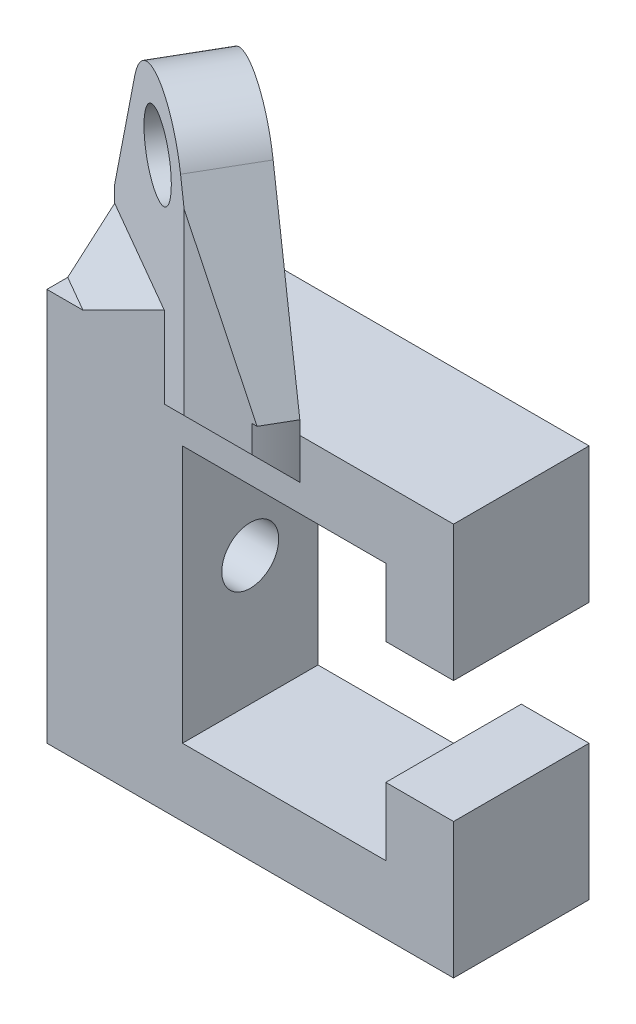
ISO-10303-21;
HEADER;
FILE_DESCRIPTION(('STEP AP214'),'2;1');
FILE_NAME('part.step','',(''),(''),'','','');
FILE_SCHEMA(('AUTOMOTIVE_DESIGN { 1 0 10303 214 1 1 1 1 }'));
ENDSEC;
DATA;
#1=APPLICATION_CONTEXT('core data for automotive mechanical design processes');
#2=APPLICATION_PROTOCOL_DEFINITION('international standard','automotive_design',2000,#1);
#3=PRODUCT_CONTEXT('',#1,'mechanical');
#4=PRODUCT('Part','Part','',(#3));
#5=PRODUCT_RELATED_PRODUCT_CATEGORY('part','',(#4));
#6=PRODUCT_DEFINITION_FORMATION('','',#4);
#7=PRODUCT_DEFINITION_CONTEXT('part definition',#1,'design');
#8=PRODUCT_DEFINITION('design','',#6,#7);
#9=PRODUCT_DEFINITION_SHAPE('','',#8);
#10=(LENGTH_UNIT() NAMED_UNIT(*) SI_UNIT(.MILLI.,.METRE.));
#11=(NAMED_UNIT(*) PLANE_ANGLE_UNIT() SI_UNIT($,.RADIAN.));
#12=(NAMED_UNIT(*) SI_UNIT($,.STERADIAN.) SOLID_ANGLE_UNIT());
#13=UNCERTAINTY_MEASURE_WITH_UNIT(LENGTH_MEASURE(1.E-05),#10,'distance_accuracy_value','');
#14=(GEOMETRIC_REPRESENTATION_CONTEXT(3) GLOBAL_UNCERTAINTY_ASSIGNED_CONTEXT((#13)) GLOBAL_UNIT_ASSIGNED_CONTEXT((#10,
#11,#12)) REPRESENTATION_CONTEXT('',''));
#15=CARTESIAN_POINT('',(0.,0.,0.));
#16=DIRECTION('',(0.,0.,1.));
#17=DIRECTION('',(1.,0.,0.));
#18=AXIS2_PLACEMENT_3D('',#15,#16,#17);
#19=CARTESIAN_POINT('',(0.,25.,0.));
#20=DIRECTION('',(0.,-1.,0.));
#21=DIRECTION('',(1.,0.,0.));
#22=AXIS2_PLACEMENT_3D('',#19,#20,#21);
#23=CYLINDRICAL_SURFACE('',#22,10.);
#24=DIRECTION('',(0.,-1.,0.));
#25=VECTOR('',#24,1.);
#26=CARTESIAN_POINT('',(7.14142842854284,25.,7.));
#27=LINE('',#26,#25);
#28=CARTESIAN_POINT('',(7.14142842854284,23.,7.));
#29=VERTEX_POINT('',#28);
#30=CARTESIAN_POINT('',(7.14142842854284,25.,7.));
#31=VERTEX_POINT('',#30);
#32=EDGE_CURVE('E236',#29,#31,#27,.F.);
#33=ORIENTED_EDGE('',*,*,#32,.F.);
#34=CARTESIAN_POINT('',(0.,15.9999999999999,0.));
#35=DIRECTION('',(0.,0.707106781186544,-0.707106781186551));
#36=DIRECTION('',(0.,-0.707106781186551,-0.707106781186544));
#37=AXIS2_PLACEMENT_3D('',#34,#35,#36);
#38=ELLIPSE('',#37,14.142135623731,10.);
#39=CARTESIAN_POINT('',(8.66025403784438,20.9999999999999,5.));
#40=VERTEX_POINT('',#39);
#41=EDGE_CURVE('E11',#29,#40,#38,.T.);
#42=ORIENTED_EDGE('',*,*,#41,.T.);
#43=DIRECTION('',(0.,-1.,0.));
#44=VECTOR('',#43,1.);
#45=CARTESIAN_POINT('',(8.66025403784437,24.,5.00000000000001));
#46=LINE('',#45,#44);
#47=CARTESIAN_POINT('',(8.66025403784437,24.,5.00000000000001));
#48=VERTEX_POINT('',#47);
#49=EDGE_CURVE('E50',#48,#40,#46,.T.);
#50=ORIENTED_EDGE('',*,*,#49,.F.);
#51=DIRECTION('',(0.,1.,0.));
#52=VECTOR('',#51,1.);
#53=CARTESIAN_POINT('',(8.66025403784437,24.,5.00000000000001));
#54=LINE('',#53,#52);
#55=CARTESIAN_POINT('',(8.66025403784437,25.,5.00000000000001));
#56=VERTEX_POINT('',#55);
#57=EDGE_CURVE('E208',#48,#56,#54,.T.);
#58=ORIENTED_EDGE('',*,*,#57,.T.);
#59=CARTESIAN_POINT('',(0.,25.,0.));
#60=DIRECTION('',(0.,1.,0.));
#61=DIRECTION('',(-1.,0.,0.));
#62=AXIS2_PLACEMENT_3D('',#59,#60,#61);
#63=CIRCLE('',#62,10.);
#64=EDGE_CURVE('E260',#31,#56,#63,.T.);
#65=ORIENTED_EDGE('',*,*,#64,.F.);
#66=EDGE_LOOP('',(#33,#42,#50,#58,#65));
#67=FACE_BOUND('',#66,.T.);
#68=ADVANCED_FACE('F35',(#67),#23,.T.);
#69=CARTESIAN_POINT('',(6.16025403784437,25.,9.3301270189222));
#70=DIRECTION('',(0.,1.,0.));
#71=DIRECTION('',(0.,0.,1.));
#72=AXIS2_PLACEMENT_3D('',#69,#70,#71);
#73=PLANE('',#72);
#74=DIRECTION('',(1.,0.,0.));
#75=VECTOR('',#74,1.);
#76=CARTESIAN_POINT('',(6.16025403784437,25.,7.));
#77=LINE('',#76,#75);
#78=CARTESIAN_POINT('',(7.50555349946513,25.,7.));
#79=VERTEX_POINT('',#78);
#80=EDGE_CURVE('E234',#31,#79,#77,.T.);
#81=ORIENTED_EDGE('',*,*,#80,.F.);
#82=ORIENTED_EDGE('',*,*,#64,.T.);
#83=DIRECTION('',(0.500000000000001,0.,-0.866025403784438));
#84=VECTOR('',#83,1.);
#85=CARTESIAN_POINT('',(6.16025403784437,25.,9.3301270189222));
#86=LINE('',#85,#84);
#87=EDGE_CURVE('E216',#79,#56,#86,.T.);
#88=ORIENTED_EDGE('',*,*,#87,.F.);
#89=EDGE_LOOP('',(#81,#82,#88));
#90=FACE_BOUND('',#89,.T.);
#91=ADVANCED_FACE('F395',(#90),#73,.F.);
#92=CARTESIAN_POINT('',(-2.50000000000001,36.,4.33012701892219));
#93=DIRECTION('',(-0.500000000000001,0.,0.866025403784438));
#94=DIRECTION('',(0.866025403784438,0.,0.500000000000001));
#95=AXIS2_PLACEMENT_3D('',#92,#93,#94);
#96=PLANE('',#95);
#97=DIRECTION('',(0.,1.,0.));
#98=VECTOR('',#97,1.);
#99=CARTESIAN_POINT('',(-10.,36.,0.));
#100=LINE('',#99,#98);
#101=CARTESIAN_POINT('',(-10.,27.,0.));
#102=VERTEX_POINT('',#101);
#103=CARTESIAN_POINT('',(-10.,28.2153903091735,0.));
#104=VERTEX_POINT('',#103);
#105=EDGE_CURVE('E223',#102,#104,#100,.T.);
#106=ORIENTED_EDGE('',*,*,#105,.F.);
#107=DIRECTION('',(0.866025403784438,0.,0.500000000000001));
#108=VECTOR('',#107,1.);
#109=CARTESIAN_POINT('',(-2.5,27.,4.33012701892219));
#110=LINE('',#109,#108);
#111=CARTESIAN_POINT('',(-1.33974596215562,27.,5.));
#112=VERTEX_POINT('',#111);
#113=EDGE_CURVE('E362',#102,#112,#110,.T.);
#114=ORIENTED_EDGE('',*,*,#113,.T.);
#115=DIRECTION('',(0.,-1.,0.));
#116=VECTOR('',#115,1.);
#117=CARTESIAN_POINT('',(-1.33974596215562,0.,5.));
#118=LINE('',#117,#116);
#119=CARTESIAN_POINT('',(-1.33974596215562,20.9999999999999,5.));
#120=VERTEX_POINT('',#119);
#121=EDGE_CURVE('E360',#112,#120,#118,.T.);
#122=ORIENTED_EDGE('',*,*,#121,.T.);
#123=DIRECTION('',(0.774596669241481,0.447213595499962,0.447213595499958));
#124=VECTOR('',#123,1.);
#125=CARTESIAN_POINT('',(-0.535898384862253,21.4641016151377,5.46410161513775));
#126=LINE('',#125,#124);
#127=CARTESIAN_POINT('',(2.12435565298213,23.,7.));
#128=VERTEX_POINT('',#127);
#129=EDGE_CURVE('E372',#120,#128,#126,.T.);
#130=ORIENTED_EDGE('',*,*,#129,.T.);
#131=DIRECTION('',(0.,1.,0.));
#132=VECTOR('',#131,1.);
#133=CARTESIAN_POINT('',(2.12435565298213,36.,7.));
#134=LINE('',#133,#132);
#135=CARTESIAN_POINT('',(2.12435565298213,36.1846096908265,7.));
#136=VERTEX_POINT('',#135);
#137=EDGE_CURVE('E230',#128,#136,#134,.T.);
#138=ORIENTED_EDGE('',*,*,#137,.T.);
#139=DIRECTION('',(-0.333086693763245,0.923076923076923,-0.192307692307693));
#140=VECTOR('',#139,1.);
#141=CARTESIAN_POINT('',(6.16025403784437,25.,9.3301270189222));
#142=LINE('',#141,#140);
#143=CARTESIAN_POINT('',(1.49704032515894,37.9230769230769,6.6378193266145));
#144=VERTEX_POINT('',#143);
#145=EDGE_CURVE('E193',#136,#144,#142,.T.);
#146=ORIENTED_EDGE('',*,*,#145,.T.);
#147=CARTESIAN_POINT('',(-2.50000000000001,36.,4.33012701892219));
#148=DIRECTION('',(-0.500000000000001,0.,0.866025403784438));
#149=DIRECTION('',(0.866025403784438,0.,0.500000000000001));
#150=AXIS2_PLACEMENT_3D('',#147,#148,#149);
#151=CIRCLE('',#150,5.);
#152=CARTESIAN_POINT('',(-6.49704032515895,37.9230769230769,2.02243471122988));
#153=VERTEX_POINT('',#152);
#154=EDGE_CURVE('E246',#144,#153,#151,.T.);
#155=ORIENTED_EDGE('',*,*,#154,.T.);
#156=DIRECTION('',(-0.333086693763246,-0.923076923076923,-0.192307692307693));
#157=VECTOR('',#156,1.);
#158=CARTESIAN_POINT('',(-11.1602540378444,25.,-0.669872981077823));
#159=LINE('',#158,#157);
#160=EDGE_CURVE('E248',#153,#104,#159,.T.);
#161=ORIENTED_EDGE('',*,*,#160,.T.);
#162=EDGE_LOOP('',(#106,#114,#122,#130,#138,#146,#155,#161));
#163=FACE_BOUND('',#162,.T.);
#164=CARTESIAN_POINT('',(-2.50000000000001,36.,4.33012701892219));
#165=DIRECTION('',(-0.500000000000001,0.,0.866025403784438));
#166=DIRECTION('',(0.866025403784438,0.,0.500000000000001));
#167=AXIS2_PLACEMENT_3D('',#164,#165,#166);
#168=CIRCLE('',#167,2.75);
#169=CARTESIAN_POINT('',(-0.118430139592799,36.,5.70512701892219));
#170=VERTEX_POINT('',#169);
#171=EDGE_CURVE('E239',#170,#170,#168,.T.);
#172=ORIENTED_EDGE('',*,*,#171,.F.);
#173=EDGE_LOOP('',(#172));
#174=FACE_BOUND('',#173,.T.);
#175=ADVANCED_FACE('F403',(#163,#174),#96,.T.);
#176=CARTESIAN_POINT('',(6.16025403784437,25.,9.3301270189222));
#177=DIRECTION('',(-0.799408065031789,-0.384615384615384,-0.461538461538463));
#178=DIRECTION('',(-0.500000000000001,0.,0.866025403784438));
#179=AXIS2_PLACEMENT_3D('',#176,#177,#178);
#180=PLANE('',#179);
#181=DIRECTION('',(-0.43355498476206,0.901127113779166,0.));
#182=VECTOR('',#181,1.);
#183=CARTESIAN_POINT('',(7.25267766081461,25.5255925606591,7.));
#184=LINE('',#183,#182);
#185=EDGE_CURVE('E355',#79,#136,#184,.T.);
#186=ORIENTED_EDGE('',*,*,#185,.F.);
#187=ORIENTED_EDGE('',*,*,#87,.T.);
#188=DIRECTION('',(-0.333086693763245,0.923076923076923,-0.192307692307693));
#189=VECTOR('',#188,1.);
#190=CARTESIAN_POINT('',(8.66025403784438,25.,5.00000000000001));
#191=LINE('',#190,#189);
#192=CARTESIAN_POINT('',(3.99704032515894,37.9230769230769,2.30769230769231));
#193=VERTEX_POINT('',#192);
#194=EDGE_CURVE('E242',#56,#193,#191,.T.);
#195=ORIENTED_EDGE('',*,*,#194,.T.);
#196=DIRECTION('',(0.500000000000001,0.,-0.866025403784438));
#197=VECTOR('',#196,1.);
#198=CARTESIAN_POINT('',(1.49704032515894,37.9230769230769,6.6378193266145));
#199=LINE('',#198,#197);
#200=EDGE_CURVE('E257',#144,#193,#199,.T.);
#201=ORIENTED_EDGE('',*,*,#200,.F.);
#202=ORIENTED_EDGE('',*,*,#145,.F.);
#203=EDGE_LOOP('',(#186,#187,#195,#201,#202));
#204=FACE_BOUND('',#203,.T.);
#205=ADVANCED_FACE('F398',(#204),#180,.F.);
#206=CARTESIAN_POINT('',(20.,24.,5.));
#207=DIRECTION('',(0.,-1.,0.));
#208=DIRECTION('',(1.,0.,0.));
#209=AXIS2_PLACEMENT_3D('',#206,#207,#208);
#210=PLANE('',#209);
#211=DIRECTION('',(-1.,0.,0.));
#212=VECTOR('',#211,1.);
#213=CARTESIAN_POINT('',(20.,24.,-5.));
#214=LINE('',#213,#212);
#215=CARTESIAN_POINT('',(20.,24.,-5.));
#216=VERTEX_POINT('',#215);
#217=CARTESIAN_POINT('',(-8.66025403784439,24.,-5.00000000000001));
#218=VERTEX_POINT('',#217);
#219=EDGE_CURVE('E314',#216,#218,#214,.T.);
#220=ORIENTED_EDGE('',*,*,#219,.T.);
#221=DIRECTION('',(0.866025403784438,0.,0.500000000000001));
#222=VECTOR('',#221,1.);
#223=CARTESIAN_POINT('',(-8.66025403784439,24.,-5.00000000000001));
#224=LINE('',#223,#222);
#225=EDGE_CURVE('E204',#218,#48,#224,.T.);
#226=ORIENTED_EDGE('',*,*,#225,.T.);
#227=DIRECTION('',(-1.,0.,0.));
#228=VECTOR('',#227,1.);
#229=CARTESIAN_POINT('',(20.,24.,5.));
#230=LINE('',#229,#228);
#231=CARTESIAN_POINT('',(20.,24.,5.));
#232=VERTEX_POINT('',#231);
#233=EDGE_CURVE('E289',#232,#48,#230,.T.);
#234=ORIENTED_EDGE('',*,*,#233,.F.);
#235=DIRECTION('',(0.,0.,-1.));
#236=VECTOR('',#235,1.);
#237=CARTESIAN_POINT('',(20.,24.,5.));
#238=LINE('',#237,#236);
#239=EDGE_CURVE('E331',#232,#216,#238,.T.);
#240=ORIENTED_EDGE('',*,*,#239,.T.);
#241=EDGE_LOOP('',(#220,#226,#234,#240));
#242=FACE_BOUND('',#241,.T.);
#243=ADVANCED_FACE('F392',(#242),#210,.F.);
#244=CARTESIAN_POINT('',(-7.3397459621557,24.,5.));
#245=VERTEX_POINT('',#244);
#246=CARTESIAN_POINT('',(-10.,24.,5.));
#247=VERTEX_POINT('',#246);
#248=EDGE_CURVE('E288',#245,#247,#230,.T.);
#249=ORIENTED_EDGE('',*,*,#248,.F.);
#250=DIRECTION('',(-0.866025403784438,0.,-0.500000000000001));
#251=VECTOR('',#250,1.);
#252=CARTESIAN_POINT('',(13.165063509461,24.,16.8384572681199));
#253=LINE('',#252,#251);
#254=CARTESIAN_POINT('',(-10.,24.,3.4641016151378));
#255=VERTEX_POINT('',#254);
#256=EDGE_CURVE('E357',#245,#255,#253,.T.);
#257=ORIENTED_EDGE('',*,*,#256,.T.);
#258=DIRECTION('',(0.,0.,-1.));
#259=VECTOR('',#258,1.);
#260=CARTESIAN_POINT('',(-10.,24.,5.));
#261=LINE('',#260,#259);
#262=EDGE_CURVE('E328',#247,#255,#261,.T.);
#263=ORIENTED_EDGE('',*,*,#262,.F.);
#264=EDGE_LOOP('',(#249,#257,#263));
#265=FACE_BOUND('',#264,.T.);
#266=ADVANCED_FACE('F414',(#265),#210,.F.);
#267=CARTESIAN_POINT('',(20.,5.,5.));
#268=DIRECTION('',(0.,-1.,0.));
#269=DIRECTION('',(0.,0.,-1.));
#270=AXIS2_PLACEMENT_3D('',#267,#268,#269);
#271=PLANE('',#270);
#272=DIRECTION('',(-1.,0.,0.));
#273=VECTOR('',#272,1.);
#274=CARTESIAN_POINT('',(20.,5.,-5.));
#275=LINE('',#274,#273);
#276=CARTESIAN_POINT('',(20.,5.,-5.));
#277=VERTEX_POINT('',#276);
#278=CARTESIAN_POINT('',(15.,5.,-5.));
#279=VERTEX_POINT('',#278);
#280=EDGE_CURVE('E267',#277,#279,#275,.T.);
#281=ORIENTED_EDGE('',*,*,#280,.T.);
#282=DIRECTION('',(0.,0.,-1.));
#283=VECTOR('',#282,1.);
#284=CARTESIAN_POINT('',(15.,5.,5.));
#285=LINE('',#284,#283);
#286=CARTESIAN_POINT('',(15.,5.,5.));
#287=VERTEX_POINT('',#286);
#288=EDGE_CURVE('E352',#287,#279,#285,.T.);
#289=ORIENTED_EDGE('',*,*,#288,.F.);
#290=DIRECTION('',(-1.,0.,0.));
#291=VECTOR('',#290,1.);
#292=CARTESIAN_POINT('',(20.,5.,5.));
#293=LINE('',#292,#291);
#294=CARTESIAN_POINT('',(20.,5.,5.));
#295=VERTEX_POINT('',#294);
#296=EDGE_CURVE('E270',#295,#287,#293,.T.);
#297=ORIENTED_EDGE('',*,*,#296,.F.);
#298=DIRECTION('',(0.,0.,-1.));
#299=VECTOR('',#298,1.);
#300=CARTESIAN_POINT('',(20.,5.,5.));
#301=LINE('',#300,#299);
#302=EDGE_CURVE('E297',#295,#277,#301,.T.);
#303=ORIENTED_EDGE('',*,*,#302,.T.);
#304=EDGE_LOOP('',(#281,#289,#297,#303));
#305=FACE_BOUND('',#304,.T.);
#306=ADVANCED_FACE('F432',(#305),#271,.F.);
#307=CARTESIAN_POINT('',(15.,5.,5.));
#308=DIRECTION('',(1.,0.,0.));
#309=DIRECTION('',(0.,1.,0.));
#310=AXIS2_PLACEMENT_3D('',#307,#308,#309);
#311=PLANE('',#310);
#312=DIRECTION('',(0.,-1.,0.));
#313=VECTOR('',#312,1.);
#314=CARTESIAN_POINT('',(15.,5.,-5.));
#315=LINE('',#314,#313);
#316=CARTESIAN_POINT('',(15.,0.,-5.));
#317=VERTEX_POINT('',#316);
#318=EDGE_CURVE('E300',#279,#317,#315,.T.);
#319=ORIENTED_EDGE('',*,*,#318,.T.);
#320=DIRECTION('',(0.,0.,-1.));
#321=VECTOR('',#320,1.);
#322=CARTESIAN_POINT('',(15.,0.,5.));
#323=LINE('',#322,#321);
#324=CARTESIAN_POINT('',(15.,0.,5.));
#325=VERTEX_POINT('',#324);
#326=EDGE_CURVE('E349',#325,#317,#323,.T.);
#327=ORIENTED_EDGE('',*,*,#326,.F.);
#328=DIRECTION('',(0.,-1.,0.));
#329=VECTOR('',#328,1.);
#330=CARTESIAN_POINT('',(15.,5.,5.));
#331=LINE('',#330,#329);
#332=EDGE_CURVE('E273',#287,#325,#331,.T.);
#333=ORIENTED_EDGE('',*,*,#332,.F.);
#334=ORIENTED_EDGE('',*,*,#288,.T.);
#335=EDGE_LOOP('',(#319,#327,#333,#334));
#336=FACE_BOUND('',#335,.T.);
#337=ADVANCED_FACE('F437',(#336),#311,.F.);
#338=CARTESIAN_POINT('',(15.,0.,5.));
#339=DIRECTION('',(0.,-1.,0.));
#340=DIRECTION('',(0.,0.,-1.));
#341=AXIS2_PLACEMENT_3D('',#338,#339,#340);
#342=PLANE('',#341);
#343=DIRECTION('',(-1.,0.,0.));
#344=VECTOR('',#343,1.);
#345=CARTESIAN_POINT('',(15.,0.,-5.));
#346=LINE('',#345,#344);
#347=CARTESIAN_POINT('',(0.,0.,-5.));
#348=VERTEX_POINT('',#347);
#349=EDGE_CURVE('E302',#317,#348,#346,.T.);
#350=ORIENTED_EDGE('',*,*,#349,.T.);
#351=DIRECTION('',(0.,0.,-1.));
#352=VECTOR('',#351,1.);
#353=CARTESIAN_POINT('',(0.,0.,5.));
#354=LINE('',#353,#352);
#355=CARTESIAN_POINT('',(0.,0.,5.));
#356=VERTEX_POINT('',#355);
#357=EDGE_CURVE('E346',#356,#348,#354,.T.);
#358=ORIENTED_EDGE('',*,*,#357,.F.);
#359=DIRECTION('',(-1.,0.,0.));
#360=VECTOR('',#359,1.);
#361=CARTESIAN_POINT('',(15.,0.,5.));
#362=LINE('',#361,#360);
#363=EDGE_CURVE('E276',#325,#356,#362,.T.);
#364=ORIENTED_EDGE('',*,*,#363,.F.);
#365=ORIENTED_EDGE('',*,*,#326,.T.);
#366=EDGE_LOOP('',(#350,#358,#364,#365));
#367=FACE_BOUND('',#366,.T.);
#368=ADVANCED_FACE('F440',(#367),#342,.F.);
#369=CARTESIAN_POINT('',(0.,0.,5.));
#370=DIRECTION('',(-1.,0.,0.));
#371=DIRECTION('',(0.,-1.,0.));
#372=AXIS2_PLACEMENT_3D('',#369,#370,#371);
#373=PLANE('',#372);
#374=CARTESIAN_POINT('',(0.,9.49999999999999,0.));
#375=DIRECTION('',(-1.,0.,0.));
#376=DIRECTION('',(0.,-1.,0.));
#377=AXIS2_PLACEMENT_3D('',#374,#375,#376);
#378=CIRCLE('',#377,2.1);
#379=CARTESIAN_POINT('',(0.,7.39999999999999,0.));
#380=VERTEX_POINT('',#379);
#381=EDGE_CURVE('E264',#380,#380,#378,.T.);
#382=ORIENTED_EDGE('',*,*,#381,.T.);
#383=EDGE_LOOP('',(#382));
#384=FACE_BOUND('',#383,.T.);
#385=DIRECTION('',(0.,1.,0.));
#386=VECTOR('',#385,1.);
#387=CARTESIAN_POINT('',(0.,0.,-5.));
#388=LINE('',#387,#386);
#389=CARTESIAN_POINT('',(0.,19.,-5.));
#390=VERTEX_POINT('',#389);
#391=EDGE_CURVE('E304',#348,#390,#388,.T.);
#392=ORIENTED_EDGE('',*,*,#391,.T.);
#393=DIRECTION('',(0.,0.,-1.));
#394=VECTOR('',#393,1.);
#395=CARTESIAN_POINT('',(0.,19.,5.));
#396=LINE('',#395,#394);
#397=CARTESIAN_POINT('',(0.,19.,5.));
#398=VERTEX_POINT('',#397);
#399=EDGE_CURVE('E343',#398,#390,#396,.T.);
#400=ORIENTED_EDGE('',*,*,#399,.F.);
#401=DIRECTION('',(0.,1.,0.));
#402=VECTOR('',#401,1.);
#403=CARTESIAN_POINT('',(0.,0.,5.));
#404=LINE('',#403,#402);
#405=EDGE_CURVE('E278',#356,#398,#404,.T.);
#406=ORIENTED_EDGE('',*,*,#405,.F.);
#407=ORIENTED_EDGE('',*,*,#357,.T.);
#408=EDGE_LOOP('',(#392,#400,#406,#407));
#409=FACE_BOUND('',#408,.T.);
#410=ADVANCED_FACE('F445',(#384,#409),#373,.F.);
#411=CARTESIAN_POINT('',(0.,19.,5.));
#412=DIRECTION('',(0.,1.,0.));
#413=DIRECTION('',(-1.,0.,0.));
#414=AXIS2_PLACEMENT_3D('',#411,#412,#413);
#415=PLANE('',#414);
#416=DIRECTION('',(1.,0.,0.));
#417=VECTOR('',#416,1.);
#418=CARTESIAN_POINT('',(0.,19.,-5.));
#419=LINE('',#418,#417);
#420=CARTESIAN_POINT('',(15.,19.,-5.));
#421=VERTEX_POINT('',#420);
#422=EDGE_CURVE('E306',#390,#421,#419,.T.);
#423=ORIENTED_EDGE('',*,*,#422,.T.);
#424=DIRECTION('',(0.,0.,-1.));
#425=VECTOR('',#424,1.);
#426=CARTESIAN_POINT('',(15.,19.,5.));
#427=LINE('',#426,#425);
#428=CARTESIAN_POINT('',(15.,19.,5.));
#429=VERTEX_POINT('',#428);
#430=EDGE_CURVE('E340',#429,#421,#427,.T.);
#431=ORIENTED_EDGE('',*,*,#430,.F.);
#432=DIRECTION('',(1.,0.,0.));
#433=VECTOR('',#432,1.);
#434=CARTESIAN_POINT('',(0.,19.,5.));
#435=LINE('',#434,#433);
#436=EDGE_CURVE('E280',#398,#429,#435,.T.);
#437=ORIENTED_EDGE('',*,*,#436,.F.);
#438=ORIENTED_EDGE('',*,*,#399,.T.);
#439=EDGE_LOOP('',(#423,#431,#437,#438));
#440=FACE_BOUND('',#439,.T.);
#441=ADVANCED_FACE('F451',(#440),#415,.F.);
#442=CARTESIAN_POINT('',(15.,19.,5.));
#443=DIRECTION('',(1.,0.,0.));
#444=DIRECTION('',(0.,1.,0.));
#445=AXIS2_PLACEMENT_3D('',#442,#443,#444);
#446=PLANE('',#445);
#447=DIRECTION('',(0.,-1.,0.));
#448=VECTOR('',#447,1.);
#449=CARTESIAN_POINT('',(15.,19.,-5.));
#450=LINE('',#449,#448);
#451=CARTESIAN_POINT('',(15.,14.,-5.));
#452=VERTEX_POINT('',#451);
#453=EDGE_CURVE('E308',#421,#452,#450,.T.);
#454=ORIENTED_EDGE('',*,*,#453,.T.);
#455=DIRECTION('',(0.,0.,-1.));
#456=VECTOR('',#455,1.);
#457=CARTESIAN_POINT('',(15.,14.,5.));
#458=LINE('',#457,#456);
#459=CARTESIAN_POINT('',(15.,14.,5.));
#460=VERTEX_POINT('',#459);
#461=EDGE_CURVE('E337',#460,#452,#458,.T.);
#462=ORIENTED_EDGE('',*,*,#461,.F.);
#463=DIRECTION('',(0.,-1.,0.));
#464=VECTOR('',#463,1.);
#465=CARTESIAN_POINT('',(15.,19.,5.));
#466=LINE('',#465,#464);
#467=EDGE_CURVE('E282',#429,#460,#466,.T.);
#468=ORIENTED_EDGE('',*,*,#467,.F.);
#469=ORIENTED_EDGE('',*,*,#430,.T.);
#470=EDGE_LOOP('',(#454,#462,#468,#469));
#471=FACE_BOUND('',#470,.T.);
#472=ADVANCED_FACE('F455',(#471),#446,.F.);
#473=CARTESIAN_POINT('',(15.,14.,5.));
#474=DIRECTION('',(0.,1.,0.));
#475=DIRECTION('',(0.,0.,1.));
#476=AXIS2_PLACEMENT_3D('',#473,#474,#475);
#477=PLANE('',#476);
#478=DIRECTION('',(1.,0.,0.));
#479=VECTOR('',#478,1.);
#480=CARTESIAN_POINT('',(15.,14.,-5.));
#481=LINE('',#480,#479);
#482=CARTESIAN_POINT('',(20.,14.,-5.));
#483=VERTEX_POINT('',#482);
#484=EDGE_CURVE('E310',#452,#483,#481,.T.);
#485=ORIENTED_EDGE('',*,*,#484,.T.);
#486=DIRECTION('',(0.,0.,-1.));
#487=VECTOR('',#486,1.);
#488=CARTESIAN_POINT('',(20.,14.,5.));
#489=LINE('',#488,#487);
#490=CARTESIAN_POINT('',(20.,14.,5.));
#491=VERTEX_POINT('',#490);
#492=EDGE_CURVE('E334',#491,#483,#489,.T.);
#493=ORIENTED_EDGE('',*,*,#492,.F.);
#494=DIRECTION('',(1.,0.,0.));
#495=VECTOR('',#494,1.);
#496=CARTESIAN_POINT('',(15.,14.,5.));
#497=LINE('',#496,#495);
#498=EDGE_CURVE('E284',#460,#491,#497,.T.);
#499=ORIENTED_EDGE('',*,*,#498,.F.);
#500=ORIENTED_EDGE('',*,*,#461,.T.);
#501=EDGE_LOOP('',(#485,#493,#499,#500));
#502=FACE_BOUND('',#501,.T.);
#503=ADVANCED_FACE('F460',(#502),#477,.F.);
#504=CARTESIAN_POINT('',(20.,14.,5.));
#505=DIRECTION('',(-1.,0.,0.));
#506=DIRECTION('',(0.,0.,1.));
#507=AXIS2_PLACEMENT_3D('',#504,#505,#506);
#508=PLANE('',#507);
#509=DIRECTION('',(0.,1.,0.));
#510=VECTOR('',#509,1.);
#511=CARTESIAN_POINT('',(20.,14.,-5.));
#512=LINE('',#511,#510);
#513=EDGE_CURVE('E312',#483,#216,#512,.T.);
#514=ORIENTED_EDGE('',*,*,#513,.T.);
#515=ORIENTED_EDGE('',*,*,#239,.F.);
#516=DIRECTION('',(0.,1.,0.));
#517=VECTOR('',#516,1.);
#518=CARTESIAN_POINT('',(20.,14.,5.));
#519=LINE('',#518,#517);
#520=EDGE_CURVE('E286',#491,#232,#519,.T.);
#521=ORIENTED_EDGE('',*,*,#520,.F.);
#522=ORIENTED_EDGE('',*,*,#492,.T.);
#523=EDGE_LOOP('',(#514,#515,#521,#522));
#524=FACE_BOUND('',#523,.T.);
#525=ADVANCED_FACE('F463',(#524),#508,.F.);
#526=CARTESIAN_POINT('',(-10.,24.,5.));
#527=DIRECTION('',(1.,0.,0.));
#528=DIRECTION('',(0.,1.,0.));
#529=AXIS2_PLACEMENT_3D('',#526,#527,#528);
#530=PLANE('',#529);
#531=DIRECTION('',(0.,0.,1.));
#532=VECTOR('',#531,1.);
#533=CARTESIAN_POINT('',(-10.,25.,-5.));
#534=LINE('',#533,#532);
#535=CARTESIAN_POINT('',(-10.,25.,-5.));
#536=VERTEX_POINT('',#535);
#537=CARTESIAN_POINT('',(-10.,25.,-2.67949192431124));
#538=VERTEX_POINT('',#537);
#539=EDGE_CURVE('E215',#536,#538,#534,.T.);
#540=ORIENTED_EDGE('',*,*,#539,.F.);
#541=DIRECTION('',(0.,-1.,0.));
#542=VECTOR('',#541,1.);
#543=CARTESIAN_POINT('',(-10.,24.,-5.));
#544=LINE('',#543,#542);
#545=CARTESIAN_POINT('',(-10.,-5.,-5.));
#546=VERTEX_POINT('',#545);
#547=EDGE_CURVE('E221',#536,#546,#544,.T.);
#548=ORIENTED_EDGE('',*,*,#547,.T.);
#549=DIRECTION('',(0.,0.,-1.));
#550=VECTOR('',#549,1.);
#551=CARTESIAN_POINT('',(-10.,-5.,5.));
#552=LINE('',#551,#550);
#553=CARTESIAN_POINT('',(-10.,-5.,5.));
#554=VERTEX_POINT('',#553);
#555=EDGE_CURVE('E325',#554,#546,#552,.T.);
#556=ORIENTED_EDGE('',*,*,#555,.F.);
#557=DIRECTION('',(0.,-1.,0.));
#558=VECTOR('',#557,1.);
#559=CARTESIAN_POINT('',(-10.,24.,5.));
#560=LINE('',#559,#558);
#561=EDGE_CURVE('E291',#247,#554,#560,.T.);
#562=ORIENTED_EDGE('',*,*,#561,.F.);
#563=ORIENTED_EDGE('',*,*,#262,.T.);
#564=DIRECTION('',(0.,0.654653670707973,-0.755928946018458));
#565=VECTOR('',#564,1.);
#566=CARTESIAN_POINT('',(-10.,23.2399274177588,4.34175783505906));
#567=LINE('',#566,#565);
#568=EDGE_CURVE('E364',#255,#102,#567,.T.);
#569=ORIENTED_EDGE('',*,*,#568,.T.);
#570=ORIENTED_EDGE('',*,*,#105,.T.);
#571=DIRECTION('',(0.,0.768221279597376,0.64018439966448));
#572=VECTOR('',#571,1.);
#573=CARTESIAN_POINT('',(-10.,25.9883371851968,-1.85587760331394));
#574=LINE('',#573,#572);
#575=EDGE_CURVE('E227',#538,#104,#574,.T.);
#576=ORIENTED_EDGE('',*,*,#575,.F.);
#577=EDGE_LOOP('',(#540,#548,#556,#562,#563,#569,#570,#576));
#578=FACE_BOUND('',#577,.T.);
#579=CARTESIAN_POINT('',(-10.,9.49999999999999,0.));
#580=DIRECTION('',(-1.,0.,0.));
#581=DIRECTION('',(0.,-1.,0.));
#582=AXIS2_PLACEMENT_3D('',#579,#580,#581);
#583=CIRCLE('',#582,2.1);
#584=CARTESIAN_POINT('',(-10.,7.39999999999999,0.));
#585=VERTEX_POINT('',#584);
#586=EDGE_CURVE('E263',#585,#585,#583,.T.);
#587=ORIENTED_EDGE('',*,*,#586,.F.);
#588=EDGE_LOOP('',(#587));
#589=FACE_BOUND('',#588,.T.);
#590=ADVANCED_FACE('F417',(#578,#589),#530,.F.);
#591=CARTESIAN_POINT('',(-10.,-5.,5.));
#592=DIRECTION('',(0.,1.,0.));
#593=DIRECTION('',(0.,0.,1.));
#594=AXIS2_PLACEMENT_3D('',#591,#592,#593);
#595=PLANE('',#594);
#596=DIRECTION('',(1.,0.,0.));
#597=VECTOR('',#596,1.);
#598=CARTESIAN_POINT('',(-10.,-5.,-5.));
#599=LINE('',#598,#597);
#600=CARTESIAN_POINT('',(20.,-5.,-5.));
#601=VERTEX_POINT('',#600);
#602=EDGE_CURVE('E317',#546,#601,#599,.T.);
#603=ORIENTED_EDGE('',*,*,#602,.T.);
#604=DIRECTION('',(0.,0.,-1.));
#605=VECTOR('',#604,1.);
#606=CARTESIAN_POINT('',(20.,-5.,5.));
#607=LINE('',#606,#605);
#608=CARTESIAN_POINT('',(20.,-5.,5.));
#609=VERTEX_POINT('',#608);
#610=EDGE_CURVE('E322',#609,#601,#607,.T.);
#611=ORIENTED_EDGE('',*,*,#610,.F.);
#612=DIRECTION('',(1.,0.,0.));
#613=VECTOR('',#612,1.);
#614=CARTESIAN_POINT('',(-10.,-5.,5.));
#615=LINE('',#614,#613);
#616=EDGE_CURVE('E293',#554,#609,#615,.T.);
#617=ORIENTED_EDGE('',*,*,#616,.F.);
#618=ORIENTED_EDGE('',*,*,#555,.T.);
#619=EDGE_LOOP('',(#603,#611,#617,#618));
#620=FACE_BOUND('',#619,.T.);
#621=ADVANCED_FACE('F425',(#620),#595,.F.);
#622=CARTESIAN_POINT('',(20.,-5.,5.));
#623=DIRECTION('',(-1.,0.,0.));
#624=DIRECTION('',(0.,0.,1.));
#625=AXIS2_PLACEMENT_3D('',#622,#623,#624);
#626=PLANE('',#625);
#627=DIRECTION('',(0.,1.,0.));
#628=VECTOR('',#627,1.);
#629=CARTESIAN_POINT('',(20.,-5.,-5.));
#630=LINE('',#629,#628);
#631=EDGE_CURVE('E274',#601,#277,#630,.T.);
#632=ORIENTED_EDGE('',*,*,#631,.T.);
#633=ORIENTED_EDGE('',*,*,#302,.F.);
#634=DIRECTION('',(0.,1.,0.));
#635=VECTOR('',#634,1.);
#636=CARTESIAN_POINT('',(20.,-5.,5.));
#637=LINE('',#636,#635);
#638=EDGE_CURVE('E295',#609,#295,#637,.T.);
#639=ORIENTED_EDGE('',*,*,#638,.F.);
#640=ORIENTED_EDGE('',*,*,#610,.T.);
#641=EDGE_LOOP('',(#632,#633,#639,#640));
#642=FACE_BOUND('',#641,.T.);
#643=ADVANCED_FACE('F428',(#642),#626,.F.);
#644=CARTESIAN_POINT('',(0.,0.,5.));
#645=DIRECTION('',(0.,0.,1.));
#646=DIRECTION('',(1.,0.,0.));
#647=AXIS2_PLACEMENT_3D('',#644,#645,#646);
#648=PLANE('',#647);
#649=DIRECTION('',(-1.,0.,0.));
#650=VECTOR('',#649,1.);
#651=CARTESIAN_POINT('',(0.,20.9999999999999,5.));
#652=LINE('',#651,#650);
#653=EDGE_CURVE('E369',#40,#120,#652,.T.);
#654=ORIENTED_EDGE('',*,*,#653,.T.);
#655=ORIENTED_EDGE('',*,*,#121,.F.);
#656=DIRECTION('',(-0.894427190999917,-0.447213595499955,0.));
#657=VECTOR('',#656,1.);
#658=CARTESIAN_POINT('',(9.06410161513775,32.2019237886467,5.));
#659=LINE('',#658,#657);
#660=EDGE_CURVE('E366',#112,#245,#659,.T.);
#661=ORIENTED_EDGE('',*,*,#660,.T.);
#662=ORIENTED_EDGE('',*,*,#248,.T.);
#663=ORIENTED_EDGE('',*,*,#561,.T.);
#664=ORIENTED_EDGE('',*,*,#616,.T.);
#665=ORIENTED_EDGE('',*,*,#638,.T.);
#666=ORIENTED_EDGE('',*,*,#296,.T.);
#667=ORIENTED_EDGE('',*,*,#332,.T.);
#668=ORIENTED_EDGE('',*,*,#363,.T.);
#669=ORIENTED_EDGE('',*,*,#405,.T.);
#670=ORIENTED_EDGE('',*,*,#436,.T.);
#671=ORIENTED_EDGE('',*,*,#467,.T.);
#672=ORIENTED_EDGE('',*,*,#498,.T.);
#673=ORIENTED_EDGE('',*,*,#520,.T.);
#674=ORIENTED_EDGE('',*,*,#233,.T.);
#675=ORIENTED_EDGE('',*,*,#49,.T.);
#676=EDGE_LOOP('',(#654,#655,#661,#662,#663,#664,#665,#666,#667,#668,#669,#670,#671,#672,#673,
#674,#675));
#677=FACE_BOUND('',#676,.T.);
#678=ADVANCED_FACE('F386',(#677),#648,.T.);
#679=CARTESIAN_POINT('',(0.,0.,-5.));
#680=DIRECTION('',(0.,0.,1.));
#681=DIRECTION('',(1.,0.,0.));
#682=AXIS2_PLACEMENT_3D('',#679,#680,#681);
#683=PLANE('',#682);
#684=ORIENTED_EDGE('',*,*,#280,.F.);
#685=ORIENTED_EDGE('',*,*,#631,.F.);
#686=ORIENTED_EDGE('',*,*,#602,.F.);
#687=ORIENTED_EDGE('',*,*,#547,.F.);
#688=DIRECTION('',(-1.,0.,0.));
#689=VECTOR('',#688,1.);
#690=CARTESIAN_POINT('',(-8.66025403784439,25.,-5.00000000000001));
#691=LINE('',#690,#689);
#692=CARTESIAN_POINT('',(-8.66025403784439,25.,-5.00000000000001));
#693=VERTEX_POINT('',#692);
#694=EDGE_CURVE('E213',#693,#536,#691,.T.);
#695=ORIENTED_EDGE('',*,*,#694,.F.);
#696=DIRECTION('',(0.,1.,0.));
#697=VECTOR('',#696,1.);
#698=CARTESIAN_POINT('',(-8.66025403784439,24.,-5.00000000000001));
#699=LINE('',#698,#697);
#700=EDGE_CURVE('E198',#218,#693,#699,.T.);
#701=ORIENTED_EDGE('',*,*,#700,.F.);
#702=ORIENTED_EDGE('',*,*,#219,.F.);
#703=ORIENTED_EDGE('',*,*,#513,.F.);
#704=ORIENTED_EDGE('',*,*,#484,.F.);
#705=ORIENTED_EDGE('',*,*,#453,.F.);
#706=ORIENTED_EDGE('',*,*,#422,.F.);
#707=ORIENTED_EDGE('',*,*,#391,.F.);
#708=ORIENTED_EDGE('',*,*,#349,.F.);
#709=ORIENTED_EDGE('',*,*,#318,.F.);
#710=EDGE_LOOP('',(#684,#685,#686,#687,#695,#701,#702,#703,#704,#705,#706,#707,#708,#709));
#711=FACE_BOUND('',#710,.T.);
#712=ADVANCED_FACE('F219',(#711),#683,.F.);
#713=CARTESIAN_POINT('',(0.,9.49999999999999,0.));
#714=DIRECTION('',(-1.,0.,0.));
#715=DIRECTION('',(0.,-1.,0.));
#716=AXIS2_PLACEMENT_3D('',#713,#714,#715);
#717=CYLINDRICAL_SURFACE('',#716,2.1);
#718=ORIENTED_EDGE('',*,*,#381,.F.);
#719=EDGE_LOOP('',(#718));
#720=FACE_BOUND('',#719,.T.);
#721=ORIENTED_EDGE('',*,*,#586,.T.);
#722=EDGE_LOOP('',(#721));
#723=FACE_BOUND('',#722,.T.);
#724=ADVANCED_FACE('F484',(#720,#723),#717,.F.);
#725=CARTESIAN_POINT('',(0.,36.,0.));
#726=DIRECTION('',(-0.500000000000001,0.,0.866025403784438));
#727=DIRECTION('',(0.866025403784438,0.,0.500000000000001));
#728=AXIS2_PLACEMENT_3D('',#725,#726,#727);
#729=PLANE('',#728);
#730=ORIENTED_EDGE('',*,*,#194,.F.);
#731=ORIENTED_EDGE('',*,*,#57,.F.);
#732=ORIENTED_EDGE('',*,*,#225,.F.);
#733=ORIENTED_EDGE('',*,*,#700,.T.);
#734=DIRECTION('',(-0.333086693763246,-0.923076923076923,-0.192307692307693));
#735=VECTOR('',#734,1.);
#736=CARTESIAN_POINT('',(-8.66025403784439,25.,-5.00000000000001));
#737=LINE('',#736,#735);
#738=CARTESIAN_POINT('',(-3.99704032515894,37.9230769230769,-2.30769230769231));
#739=VERTEX_POINT('',#738);
#740=EDGE_CURVE('E182',#739,#693,#737,.T.);
#741=ORIENTED_EDGE('',*,*,#740,.F.);
#742=CARTESIAN_POINT('',(0.,36.,0.));
#743=DIRECTION('',(-0.500000000000001,0.,0.866025403784438));
#744=DIRECTION('',(0.866025403784438,0.,0.500000000000001));
#745=AXIS2_PLACEMENT_3D('',#742,#743,#744);
#746=CIRCLE('',#745,5.);
#747=EDGE_CURVE('E194',#193,#739,#746,.T.);
#748=ORIENTED_EDGE('',*,*,#747,.F.);
#749=EDGE_LOOP('',(#730,#731,#732,#733,#741,#748));
#750=FACE_BOUND('',#749,.T.);
#751=CARTESIAN_POINT('',(0.,36.,0.));
#752=DIRECTION('',(-0.500000000000001,0.,0.866025403784438));
#753=DIRECTION('',(0.866025403784438,0.,0.500000000000001));
#754=AXIS2_PLACEMENT_3D('',#751,#752,#753);
#755=CIRCLE('',#754,2.75);
#756=CARTESIAN_POINT('',(2.38156986040721,36.,1.375));
#757=VERTEX_POINT('',#756);
#758=EDGE_CURVE('E238',#757,#757,#755,.T.);
#759=ORIENTED_EDGE('',*,*,#758,.T.);
#760=EDGE_LOOP('',(#759));
#761=FACE_BOUND('',#760,.T.);
#762=ADVANCED_FACE('F200',(#750,#761),#729,.F.);
#763=CARTESIAN_POINT('',(-2.50000000000001,36.,4.33012701892219));
#764=DIRECTION('',(0.500000000000001,0.,-0.866025403784438));
#765=DIRECTION('',(-0.866025403784438,0.,-0.500000000000001));
#766=AXIS2_PLACEMENT_3D('',#763,#764,#765);
#767=CYLINDRICAL_SURFACE('',#766,5.);
#768=ORIENTED_EDGE('',*,*,#747,.T.);
#769=DIRECTION('',(0.500000000000001,0.,-0.866025403784438));
#770=VECTOR('',#769,1.);
#771=CARTESIAN_POINT('',(-6.49704032515895,37.9230769230769,2.02243471122988));
#772=LINE('',#771,#770);
#773=EDGE_CURVE('E191',#153,#739,#772,.T.);
#774=ORIENTED_EDGE('',*,*,#773,.F.);
#775=ORIENTED_EDGE('',*,*,#154,.F.);
#776=ORIENTED_EDGE('',*,*,#200,.T.);
#777=EDGE_LOOP('',(#768,#774,#775,#776));
#778=FACE_BOUND('',#777,.T.);
#779=ADVANCED_FACE('F509',(#778),#767,.T.);
#780=CARTESIAN_POINT('',(-11.1602540378444,25.,-0.669872981077823));
#781=DIRECTION('',(0.799408065031789,-0.384615384615385,0.461538461538462));
#782=DIRECTION('',(0.500000000000001,0.,-0.866025403784438));
#783=AXIS2_PLACEMENT_3D('',#780,#781,#782);
#784=PLANE('',#783);
#785=DIRECTION('',(0.500000000000001,0.,-0.866025403784438));
#786=VECTOR('',#785,1.);
#787=CARTESIAN_POINT('',(-11.1602540378444,25.,-0.669872981077823));
#788=LINE('',#787,#786);
#789=EDGE_CURVE('E187',#538,#693,#788,.T.);
#790=ORIENTED_EDGE('',*,*,#789,.F.);
#791=ORIENTED_EDGE('',*,*,#575,.T.);
#792=ORIENTED_EDGE('',*,*,#160,.F.);
#793=ORIENTED_EDGE('',*,*,#773,.T.);
#794=ORIENTED_EDGE('',*,*,#740,.T.);
#795=EDGE_LOOP('',(#790,#791,#792,#793,#794));
#796=FACE_BOUND('',#795,.T.);
#797=ADVANCED_FACE('F184',(#796),#784,.F.);
#798=CARTESIAN_POINT('',(-2.50000000000001,36.,4.33012701892219));
#799=DIRECTION('',(0.500000000000001,0.,-0.866025403784438));
#800=DIRECTION('',(-0.866025403784438,0.,-0.500000000000001));
#801=AXIS2_PLACEMENT_3D('',#798,#799,#800);
#802=CYLINDRICAL_SURFACE('',#801,2.75);
#803=ORIENTED_EDGE('',*,*,#171,.T.);
#804=EDGE_LOOP('',(#803));
#805=FACE_BOUND('',#804,.T.);
#806=ORIENTED_EDGE('',*,*,#758,.F.);
#807=EDGE_LOOP('',(#806));
#808=FACE_BOUND('',#807,.T.);
#809=ADVANCED_FACE('F506',(#805,#808),#802,.F.);
#810=CARTESIAN_POINT('',(0.,41.,7.));
#811=DIRECTION('',(0.,0.,1.));
#812=DIRECTION('',(1.,0.,0.));
#813=AXIS2_PLACEMENT_3D('',#810,#811,#812);
#814=PLANE('',#813);
#815=ORIENTED_EDGE('',*,*,#137,.F.);
#816=DIRECTION('',(1.,0.,0.));
#817=VECTOR('',#816,1.);
#818=CARTESIAN_POINT('',(0.,23.,7.));
#819=LINE('',#818,#817);
#820=EDGE_CURVE('E44',#128,#29,#819,.T.);
#821=ORIENTED_EDGE('',*,*,#820,.T.);
#822=ORIENTED_EDGE('',*,*,#32,.T.);
#823=ORIENTED_EDGE('',*,*,#80,.T.);
#824=ORIENTED_EDGE('',*,*,#185,.T.);
#825=EDGE_LOOP('',(#815,#821,#822,#823,#824));
#826=FACE_BOUND('',#825,.T.);
#827=ADVANCED_FACE('F379',(#826),#814,.T.);
#828=CARTESIAN_POINT('',(13.165063509461,24.,16.8384572681199));
#829=DIRECTION('',(0.353553390593273,-0.707106781186551,-0.612372435695791));
#830=DIRECTION('',(-0.866025403784438,0.,-0.500000000000001));
#831=AXIS2_PLACEMENT_3D('',#828,#829,#830);
#832=PLANE('',#831);
#833=ORIENTED_EDGE('',*,*,#113,.F.);
#834=ORIENTED_EDGE('',*,*,#568,.F.);
#835=ORIENTED_EDGE('',*,*,#256,.F.);
#836=ORIENTED_EDGE('',*,*,#660,.F.);
#837=EDGE_LOOP('',(#833,#834,#835,#836));
#838=FACE_BOUND('',#837,.T.);
#839=ADVANCED_FACE('F411',(#838),#832,.F.);
#840=CARTESIAN_POINT('',(0.,20.9999999999999,5.));
#841=DIRECTION('',(0.,0.707106781186544,-0.707106781186551));
#842=DIRECTION('',(-1.,0.,0.));
#843=AXIS2_PLACEMENT_3D('',#840,#841,#842);
#844=PLANE('',#843);
#845=ORIENTED_EDGE('',*,*,#41,.F.);
#846=ORIENTED_EDGE('',*,*,#820,.F.);
#847=ORIENTED_EDGE('',*,*,#129,.F.);
#848=ORIENTED_EDGE('',*,*,#653,.F.);
#849=EDGE_LOOP('',(#845,#846,#847,#848));
#850=FACE_BOUND('',#849,.T.);
#851=ADVANCED_FACE('F37',(#850),#844,.F.);
#852=CARTESIAN_POINT('',(0.,25.,0.));
#853=DIRECTION('',(0.,1.,0.));
#854=DIRECTION('',(-1.,0.,0.));
#855=AXIS2_PLACEMENT_3D('',#852,#853,#854);
#856=PLANE('',#855);
#857=ORIENTED_EDGE('',*,*,#789,.T.);
#858=ORIENTED_EDGE('',*,*,#694,.T.);
#859=ORIENTED_EDGE('',*,*,#539,.T.);
#860=EDGE_LOOP('',(#857,#858,#859));
#861=FACE_BOUND('',#860,.T.);
#862=ADVANCED_FACE('F212',(#861),#856,.T.);
#863=CLOSED_SHELL('',(#68,#91,#175,#205,#243,#266,#306,#337,#368,#410,#441,#472,#503,#525,#590,
#621,#643,#678,#712,#724,#762,#779,#797,#809,#827,#839,#851,#862));
#864=MANIFOLD_SOLID_BREP('B2',#863);
#865=ADVANCED_BREP_SHAPE_REPRESENTATION('',(#18,#864),#14);
#866=SHAPE_DEFINITION_REPRESENTATION(#9,#865);
ENDSEC;
END-ISO-10303-21;
